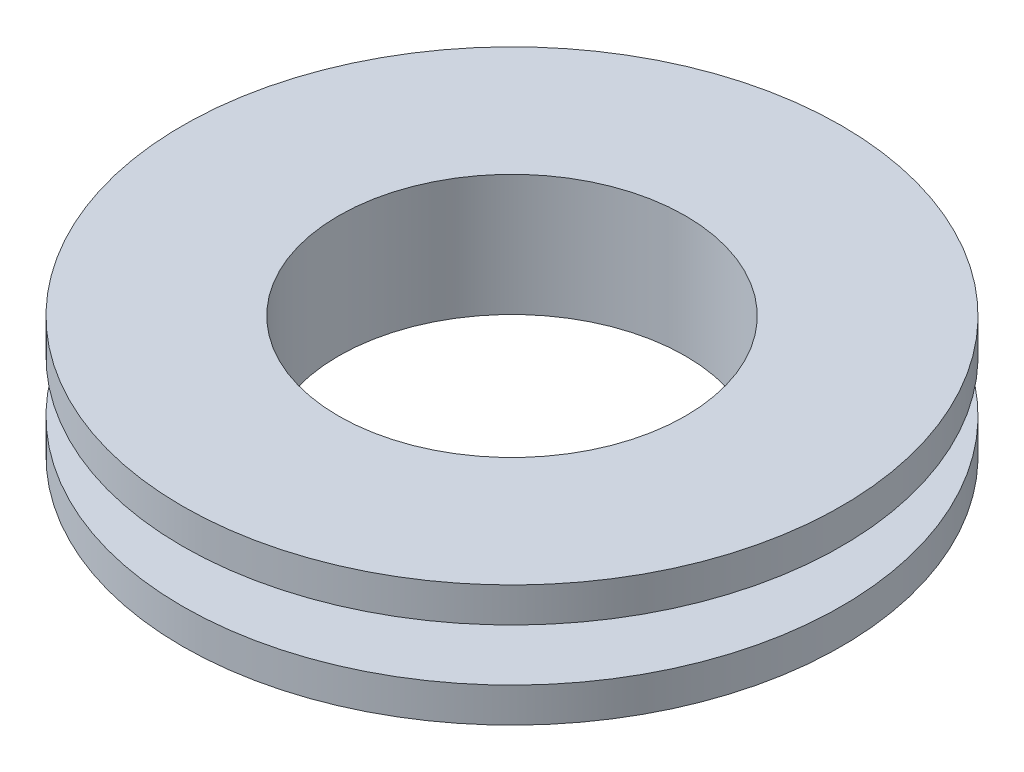
ISO-10303-21;
HEADER;
FILE_DESCRIPTION(('STEP AP214'),'2;1');
FILE_NAME('part.step','',(''),(''),'','','');
FILE_SCHEMA(('AUTOMOTIVE_DESIGN { 1 0 10303 214 1 1 1 1 }'));
ENDSEC;
DATA;
#1=APPLICATION_CONTEXT('core data for automotive mechanical design processes');
#2=APPLICATION_PROTOCOL_DEFINITION('international standard','automotive_design',2000,#1);
#3=PRODUCT_CONTEXT('',#1,'mechanical');
#4=PRODUCT('Part','Part','',(#3));
#5=PRODUCT_RELATED_PRODUCT_CATEGORY('part','',(#4));
#6=PRODUCT_DEFINITION_FORMATION('','',#4);
#7=PRODUCT_DEFINITION_CONTEXT('part definition',#1,'design');
#8=PRODUCT_DEFINITION('design','',#6,#7);
#9=PRODUCT_DEFINITION_SHAPE('','',#8);
#10=(LENGTH_UNIT() NAMED_UNIT(*) SI_UNIT(.MILLI.,.METRE.));
#11=(NAMED_UNIT(*) PLANE_ANGLE_UNIT() SI_UNIT($,.RADIAN.));
#12=(NAMED_UNIT(*) SI_UNIT($,.STERADIAN.) SOLID_ANGLE_UNIT());
#13=UNCERTAINTY_MEASURE_WITH_UNIT(LENGTH_MEASURE(1.E-05),#10,'distance_accuracy_value','');
#14=(GEOMETRIC_REPRESENTATION_CONTEXT(3) GLOBAL_UNCERTAINTY_ASSIGNED_CONTEXT((#13)) GLOBAL_UNIT_ASSIGNED_CONTEXT((#10,
#11,#12)) REPRESENTATION_CONTEXT('',''));
#15=CARTESIAN_POINT('',(0.,0.,0.));
#16=DIRECTION('',(0.,0.,1.));
#17=DIRECTION('',(1.,0.,0.));
#18=AXIS2_PLACEMENT_3D('',#15,#16,#17);
#19=CARTESIAN_POINT('',(0.,1.,0.));
#20=DIRECTION('',(0.,1.,0.));
#21=DIRECTION('',(0.,0.,1.));
#22=AXIS2_PLACEMENT_3D('',#19,#20,#21);
#23=PLANE('',#22);
#24=CARTESIAN_POINT('',(0.,1.,0.));
#25=DIRECTION('',(0.,1.,0.));
#26=DIRECTION('',(0.,0.,1.));
#27=AXIS2_PLACEMENT_3D('',#24,#25,#26);
#28=CIRCLE('',#27,9.5);
#29=CARTESIAN_POINT('',(0.,1.,9.5));
#30=VERTEX_POINT('',#29);
#31=EDGE_CURVE('E11',#30,#30,#28,.T.);
#32=ORIENTED_EDGE('',*,*,#31,.T.);
#33=EDGE_LOOP('',(#32));
#34=FACE_BOUND('',#33,.T.);
#35=CARTESIAN_POINT('',(0.,1.,0.));
#36=DIRECTION('',(0.,1.,0.));
#37=DIRECTION('',(0.,0.,1.));
#38=AXIS2_PLACEMENT_3D('',#35,#36,#37);
#39=CIRCLE('',#38,6.);
#40=CARTESIAN_POINT('',(0.,1.,6.));
#41=VERTEX_POINT('',#40);
#42=EDGE_CURVE('E66',#41,#41,#39,.T.);
#43=ORIENTED_EDGE('',*,*,#42,.F.);
#44=EDGE_LOOP('',(#43));
#45=FACE_BOUND('',#44,.T.);
#46=ADVANCED_FACE('F50',(#34,#45),#23,.T.);
#47=CARTESIAN_POINT('',(0.,0.,0.));
#48=DIRECTION('',(0.,1.,0.));
#49=DIRECTION('',(0.,0.,1.));
#50=AXIS2_PLACEMENT_3D('',#47,#48,#49);
#51=PLANE('',#50);
#52=CARTESIAN_POINT('',(0.,0.,0.));
#53=DIRECTION('',(0.,1.,0.));
#54=DIRECTION('',(0.,0.,1.));
#55=AXIS2_PLACEMENT_3D('',#52,#53,#54);
#56=CIRCLE('',#55,9.5);
#57=CARTESIAN_POINT('',(0.,0.,9.5));
#58=VERTEX_POINT('',#57);
#59=EDGE_CURVE('E54',#58,#58,#56,.T.);
#60=ORIENTED_EDGE('',*,*,#59,.F.);
#61=EDGE_LOOP('',(#60));
#62=FACE_BOUND('',#61,.T.);
#63=CARTESIAN_POINT('',(0.,0.,0.));
#64=DIRECTION('',(0.,1.,0.));
#65=DIRECTION('',(0.,0.,1.));
#66=AXIS2_PLACEMENT_3D('',#63,#64,#65);
#67=CIRCLE('',#66,5.);
#68=CARTESIAN_POINT('',(0.,0.,5.));
#69=VERTEX_POINT('',#68);
#70=EDGE_CURVE('E61',#69,#69,#67,.T.);
#71=ORIENTED_EDGE('',*,*,#70,.T.);
#72=EDGE_LOOP('',(#71));
#73=FACE_BOUND('',#72,.T.);
#74=ADVANCED_FACE('F99',(#62,#73),#51,.F.);
#75=CARTESIAN_POINT('',(0.,1.,0.));
#76=DIRECTION('',(0.,-1.,0.));
#77=DIRECTION('',(0.,0.,-1.));
#78=AXIS2_PLACEMENT_3D('',#75,#76,#77);
#79=CYLINDRICAL_SURFACE('',#78,9.5);
#80=ORIENTED_EDGE('',*,*,#31,.F.);
#81=EDGE_LOOP('',(#80));
#82=FACE_BOUND('',#81,.T.);
#83=ORIENTED_EDGE('',*,*,#59,.T.);
#84=EDGE_LOOP('',(#83));
#85=FACE_BOUND('',#84,.T.);
#86=ADVANCED_FACE('F52',(#82,#85),#79,.T.);
#87=CARTESIAN_POINT('',(0.,1.,0.));
#88=DIRECTION('',(0.,-1.,0.));
#89=DIRECTION('',(0.,0.,-1.));
#90=AXIS2_PLACEMENT_3D('',#87,#88,#89);
#91=CYLINDRICAL_SURFACE('',#90,5.);
#92=ORIENTED_EDGE('',*,*,#70,.F.);
#93=EDGE_LOOP('',(#92));
#94=FACE_BOUND('',#93,.T.);
#95=CARTESIAN_POINT('',(0.,3.5,0.));
#96=DIRECTION('',(0.,1.,0.));
#97=DIRECTION('',(0.,0.,1.));
#98=AXIS2_PLACEMENT_3D('',#95,#96,#97);
#99=CIRCLE('',#98,5.);
#100=CARTESIAN_POINT('',(0.,3.5,5.));
#101=VERTEX_POINT('',#100);
#102=EDGE_CURVE('E75',#101,#101,#99,.T.);
#103=ORIENTED_EDGE('',*,*,#102,.T.);
#104=EDGE_LOOP('',(#103));
#105=FACE_BOUND('',#104,.T.);
#106=ADVANCED_FACE('F81',(#94,#105),#91,.F.);
#107=CARTESIAN_POINT('',(0.,2.5,0.));
#108=DIRECTION('',(0.,-1.,0.));
#109=DIRECTION('',(0.,0.,-1.));
#110=AXIS2_PLACEMENT_3D('',#107,#108,#109);
#111=CYLINDRICAL_SURFACE('',#110,6.);
#112=CARTESIAN_POINT('',(0.,2.5,0.));
#113=DIRECTION('',(0.,1.,0.));
#114=DIRECTION('',(0.,0.,1.));
#115=AXIS2_PLACEMENT_3D('',#112,#113,#114);
#116=CIRCLE('',#115,6.);
#117=CARTESIAN_POINT('',(0.,2.5,6.));
#118=VERTEX_POINT('',#117);
#119=EDGE_CURVE('E65',#118,#118,#116,.T.);
#120=ORIENTED_EDGE('',*,*,#119,.F.);
#121=EDGE_LOOP('',(#120));
#122=FACE_BOUND('',#121,.T.);
#123=ORIENTED_EDGE('',*,*,#42,.T.);
#124=EDGE_LOOP('',(#123));
#125=FACE_BOUND('',#124,.T.);
#126=ADVANCED_FACE('F86',(#122,#125),#111,.T.);
#127=CARTESIAN_POINT('',(0.,3.5,0.));
#128=DIRECTION('',(0.,1.,0.));
#129=DIRECTION('',(0.,0.,1.));
#130=AXIS2_PLACEMENT_3D('',#127,#128,#129);
#131=PLANE('',#130);
#132=CARTESIAN_POINT('',(0.,3.5,0.));
#133=DIRECTION('',(0.,1.,0.));
#134=DIRECTION('',(0.,0.,1.));
#135=AXIS2_PLACEMENT_3D('',#132,#133,#134);
#136=CIRCLE('',#135,9.5);
#137=CARTESIAN_POINT('',(0.,3.5,9.5));
#138=VERTEX_POINT('',#137);
#139=EDGE_CURVE('E69',#138,#138,#136,.T.);
#140=ORIENTED_EDGE('',*,*,#139,.T.);
#141=EDGE_LOOP('',(#140));
#142=FACE_BOUND('',#141,.T.);
#143=ORIENTED_EDGE('',*,*,#102,.F.);
#144=EDGE_LOOP('',(#143));
#145=FACE_BOUND('',#144,.T.);
#146=ADVANCED_FACE('F83',(#142,#145),#131,.T.);
#147=CARTESIAN_POINT('',(0.,2.5,0.));
#148=DIRECTION('',(0.,1.,0.));
#149=DIRECTION('',(0.,0.,1.));
#150=AXIS2_PLACEMENT_3D('',#147,#148,#149);
#151=PLANE('',#150);
#152=ORIENTED_EDGE('',*,*,#119,.T.);
#153=EDGE_LOOP('',(#152));
#154=FACE_BOUND('',#153,.T.);
#155=CARTESIAN_POINT('',(0.,2.5,0.));
#156=DIRECTION('',(0.,1.,0.));
#157=DIRECTION('',(0.,0.,1.));
#158=AXIS2_PLACEMENT_3D('',#155,#156,#157);
#159=CIRCLE('',#158,9.5);
#160=CARTESIAN_POINT('',(0.,2.5,9.5));
#161=VERTEX_POINT('',#160);
#162=EDGE_CURVE('E72',#161,#161,#159,.T.);
#163=ORIENTED_EDGE('',*,*,#162,.F.);
#164=EDGE_LOOP('',(#163));
#165=FACE_BOUND('',#164,.T.);
#166=ADVANCED_FACE('F85',(#154,#165),#151,.F.);
#167=CARTESIAN_POINT('',(0.,3.5,0.));
#168=DIRECTION('',(0.,-1.,0.));
#169=DIRECTION('',(0.,0.,-1.));
#170=AXIS2_PLACEMENT_3D('',#167,#168,#169);
#171=CYLINDRICAL_SURFACE('',#170,9.5);
#172=ORIENTED_EDGE('',*,*,#139,.F.);
#173=EDGE_LOOP('',(#172));
#174=FACE_BOUND('',#173,.T.);
#175=ORIENTED_EDGE('',*,*,#162,.T.);
#176=EDGE_LOOP('',(#175));
#177=FACE_BOUND('',#176,.T.);
#178=ADVANCED_FACE('F93',(#174,#177),#171,.T.);
#179=CLOSED_SHELL('',(#46,#74,#86,#106,#126,#146,#166,#178));
#180=MANIFOLD_SOLID_BREP('B2',#179);
#181=ADVANCED_BREP_SHAPE_REPRESENTATION('',(#18,#180),#14);
#182=SHAPE_DEFINITION_REPRESENTATION(#9,#181);
ENDSEC;
END-ISO-10303-21;
